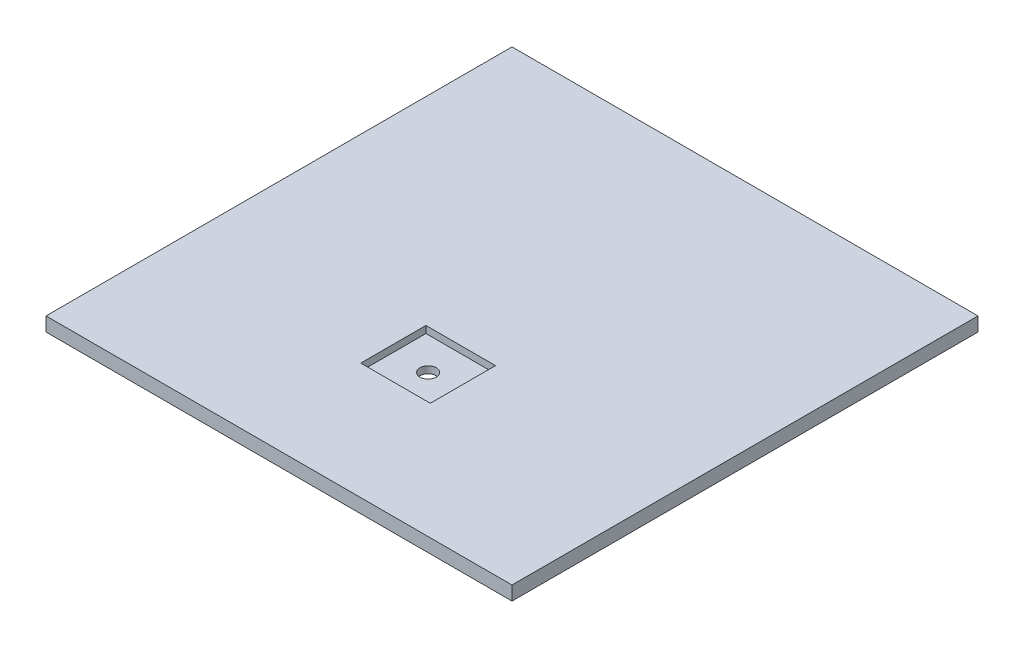
ISO-10303-21;
HEADER;
FILE_DESCRIPTION(('STEP AP214'),'2;1');
FILE_NAME('part.step','',(''),(''),'','','');
FILE_SCHEMA(('AUTOMOTIVE_DESIGN { 1 0 10303 214 1 1 1 1 }'));
ENDSEC;
DATA;
#1=APPLICATION_CONTEXT('core data for automotive mechanical design processes');
#2=APPLICATION_PROTOCOL_DEFINITION('international standard','automotive_design',2000,#1);
#3=PRODUCT_CONTEXT('',#1,'mechanical');
#4=PRODUCT('Part','Part','',(#3));
#5=PRODUCT_RELATED_PRODUCT_CATEGORY('part','',(#4));
#6=PRODUCT_DEFINITION_FORMATION('','',#4);
#7=PRODUCT_DEFINITION_CONTEXT('part definition',#1,'design');
#8=PRODUCT_DEFINITION('design','',#6,#7);
#9=PRODUCT_DEFINITION_SHAPE('','',#8);
#10=(LENGTH_UNIT() NAMED_UNIT(*) SI_UNIT(.MILLI.,.METRE.));
#11=(NAMED_UNIT(*) PLANE_ANGLE_UNIT() SI_UNIT($,.RADIAN.));
#12=(NAMED_UNIT(*) SI_UNIT($,.STERADIAN.) SOLID_ANGLE_UNIT());
#13=UNCERTAINTY_MEASURE_WITH_UNIT(LENGTH_MEASURE(1.E-05),#10,'distance_accuracy_value','');
#14=(GEOMETRIC_REPRESENTATION_CONTEXT(3) GLOBAL_UNCERTAINTY_ASSIGNED_CONTEXT((#13)) GLOBAL_UNIT_ASSIGNED_CONTEXT((#10,
#11,#12)) REPRESENTATION_CONTEXT('',''));
#15=CARTESIAN_POINT('',(0.,0.,0.));
#16=DIRECTION('',(0.,0.,1.));
#17=DIRECTION('',(1.,0.,0.));
#18=AXIS2_PLACEMENT_3D('',#15,#16,#17);
#19=CARTESIAN_POINT('',(12.953774531148,3.,9.61478711162257));
#20=DIRECTION('',(0.,-1.,0.));
#21=DIRECTION('',(0.,0.,-1.));
#22=AXIS2_PLACEMENT_3D('',#19,#20,#21);
#23=CYLINDRICAL_SURFACE('',#22,1.75);
#24=CARTESIAN_POINT('',(12.953774531148,0.,9.61478711162257));
#25=DIRECTION('',(0.,1.,0.));
#26=DIRECTION('',(0.,0.,1.));
#27=AXIS2_PLACEMENT_3D('',#24,#25,#26);
#28=CIRCLE('',#27,1.75);
#29=CARTESIAN_POINT('',(12.953774531148,0.,11.3647871116226));
#30=VERTEX_POINT('',#29);
#31=EDGE_CURVE('E146',#30,#30,#28,.T.);
#32=ORIENTED_EDGE('',*,*,#31,.F.);
#33=EDGE_LOOP('',(#32));
#34=FACE_BOUND('',#33,.T.);
#35=CARTESIAN_POINT('',(12.953774531148,1.5,9.61478711162257));
#36=DIRECTION('',(0.,1.,0.));
#37=DIRECTION('',(0.,0.,1.));
#38=AXIS2_PLACEMENT_3D('',#35,#36,#37);
#39=CIRCLE('',#38,1.75);
#40=CARTESIAN_POINT('',(12.953774531148,1.5,11.3647871116226));
#41=VERTEX_POINT('',#40);
#42=EDGE_CURVE('E37',#41,#41,#39,.T.);
#43=ORIENTED_EDGE('',*,*,#42,.T.);
#44=EDGE_LOOP('',(#43));
#45=FACE_BOUND('',#44,.T.);
#46=ADVANCED_FACE('F33',(#34,#45),#23,.F.);
#47=CARTESIAN_POINT('',(0.,3.,0.));
#48=DIRECTION('',(0.,1.,0.));
#49=DIRECTION('',(0.,0.,1.));
#50=AXIS2_PLACEMENT_3D('',#47,#48,#49);
#51=PLANE('',#50);
#52=DIRECTION('',(0.,0.,1.));
#53=VECTOR('',#52,1.);
#54=CARTESIAN_POINT('',(5.4915322734334,3.,2.61893499501515));
#55=LINE('',#54,#53);
#56=CARTESIAN_POINT('',(5.4915322734334,3.,2.61893499501515));
#57=VERTEX_POINT('',#56);
#58=CARTESIAN_POINT('',(5.4915322734334,3.,16.61063922823));
#59=VERTEX_POINT('',#58);
#60=EDGE_CURVE('E49',#57,#59,#55,.T.);
#61=ORIENTED_EDGE('',*,*,#60,.F.);
#62=DIRECTION('',(-1.,0.,0.));
#63=VECTOR('',#62,1.);
#64=CARTESIAN_POINT('',(5.4915322734334,3.,2.61893499501515));
#65=LINE('',#64,#63);
#66=CARTESIAN_POINT('',(20.4160167888626,3.,2.61893499501515));
#67=VERTEX_POINT('',#66);
#68=EDGE_CURVE('E128',#67,#57,#65,.T.);
#69=ORIENTED_EDGE('',*,*,#68,.F.);
#70=DIRECTION('',(0.,0.,-1.));
#71=VECTOR('',#70,1.);
#72=CARTESIAN_POINT('',(20.4160167888626,3.,2.61893499501515));
#73=LINE('',#72,#71);
#74=CARTESIAN_POINT('',(20.4160167888626,3.,16.61063922823));
#75=VERTEX_POINT('',#74);
#76=EDGE_CURVE('E131',#75,#67,#73,.T.);
#77=ORIENTED_EDGE('',*,*,#76,.F.);
#78=DIRECTION('',(1.,0.,0.));
#79=VECTOR('',#78,1.);
#80=CARTESIAN_POINT('',(5.4915322734334,3.,16.61063922823));
#81=LINE('',#80,#79);
#82=EDGE_CURVE('E137',#59,#75,#81,.T.);
#83=ORIENTED_EDGE('',*,*,#82,.F.);
#84=EDGE_LOOP('',(#61,#69,#77,#83));
#85=FACE_BOUND('',#84,.T.);
#86=DIRECTION('',(0.,0.,1.));
#87=VECTOR('',#86,1.);
#88=CARTESIAN_POINT('',(-37.046225468852,3.,-58.3852128883774));
#89=LINE('',#88,#87);
#90=CARTESIAN_POINT('',(-37.046225468852,3.,-58.3852128883774));
#91=VERTEX_POINT('',#90);
#92=CARTESIAN_POINT('',(-37.046225468852,3.,41.6147871116226));
#93=VERTEX_POINT('',#92);
#94=EDGE_CURVE('E150',#91,#93,#89,.T.);
#95=ORIENTED_EDGE('',*,*,#94,.T.);
#96=DIRECTION('',(1.,0.,0.));
#97=VECTOR('',#96,1.);
#98=CARTESIAN_POINT('',(-37.046225468852,3.,41.6147871116226));
#99=LINE('',#98,#97);
#100=CARTESIAN_POINT('',(62.953774531148,3.,41.6147871116226));
#101=VERTEX_POINT('',#100);
#102=EDGE_CURVE('E86',#93,#101,#99,.T.);
#103=ORIENTED_EDGE('',*,*,#102,.T.);
#104=DIRECTION('',(0.,0.,-1.));
#105=VECTOR('',#104,1.);
#106=CARTESIAN_POINT('',(62.953774531148,3.,-58.3852128883774));
#107=LINE('',#106,#105);
#108=CARTESIAN_POINT('',(62.953774531148,3.,-58.3852128883774));
#109=VERTEX_POINT('',#108);
#110=EDGE_CURVE('E153',#101,#109,#107,.T.);
#111=ORIENTED_EDGE('',*,*,#110,.T.);
#112=DIRECTION('',(-1.,0.,0.));
#113=VECTOR('',#112,1.);
#114=CARTESIAN_POINT('',(-37.046225468852,3.,-58.3852128883774));
#115=LINE('',#114,#113);
#116=EDGE_CURVE('E58',#109,#91,#115,.T.);
#117=ORIENTED_EDGE('',*,*,#116,.T.);
#118=EDGE_LOOP('',(#95,#103,#111,#117));
#119=FACE_BOUND('',#118,.T.);
#120=ADVANCED_FACE('F193',(#85,#119),#51,.T.);
#121=CARTESIAN_POINT('',(0.,0.,0.));
#122=DIRECTION('',(0.,1.,0.));
#123=DIRECTION('',(0.,0.,1.));
#124=AXIS2_PLACEMENT_3D('',#121,#122,#123);
#125=PLANE('',#124);
#126=DIRECTION('',(0.,0.,1.));
#127=VECTOR('',#126,1.);
#128=CARTESIAN_POINT('',(-37.046225468852,0.,-58.3852128883774));
#129=LINE('',#128,#127);
#130=CARTESIAN_POINT('',(-37.046225468852,0.,-58.3852128883774));
#131=VERTEX_POINT('',#130);
#132=CARTESIAN_POINT('',(-37.046225468852,0.,41.6147871116226));
#133=VERTEX_POINT('',#132);
#134=EDGE_CURVE('E149',#131,#133,#129,.T.);
#135=ORIENTED_EDGE('',*,*,#134,.F.);
#136=DIRECTION('',(-1.,0.,0.));
#137=VECTOR('',#136,1.);
#138=CARTESIAN_POINT('',(-37.046225468852,0.,-58.3852128883774));
#139=LINE('',#138,#137);
#140=CARTESIAN_POINT('',(62.953774531148,0.,-58.3852128883774));
#141=VERTEX_POINT('',#140);
#142=EDGE_CURVE('E79',#141,#131,#139,.T.);
#143=ORIENTED_EDGE('',*,*,#142,.F.);
#144=DIRECTION('',(0.,0.,-1.));
#145=VECTOR('',#144,1.);
#146=CARTESIAN_POINT('',(62.953774531148,0.,-58.3852128883774));
#147=LINE('',#146,#145);
#148=CARTESIAN_POINT('',(62.953774531148,0.,41.6147871116226));
#149=VERTEX_POINT('',#148);
#150=EDGE_CURVE('E161',#149,#141,#147,.T.);
#151=ORIENTED_EDGE('',*,*,#150,.F.);
#152=DIRECTION('',(1.,0.,0.));
#153=VECTOR('',#152,1.);
#154=CARTESIAN_POINT('',(-37.046225468852,0.,41.6147871116226));
#155=LINE('',#154,#153);
#156=EDGE_CURVE('E159',#133,#149,#155,.T.);
#157=ORIENTED_EDGE('',*,*,#156,.F.);
#158=EDGE_LOOP('',(#135,#143,#151,#157));
#159=FACE_BOUND('',#158,.T.);
#160=ORIENTED_EDGE('',*,*,#31,.T.);
#161=EDGE_LOOP('',(#160));
#162=FACE_BOUND('',#161,.T.);
#163=ADVANCED_FACE('F175',(#159,#162),#125,.F.);
#164=CARTESIAN_POINT('',(-37.046225468852,3.,-58.3852128883774));
#165=DIRECTION('',(1.,0.,0.));
#166=DIRECTION('',(0.,0.,-1.));
#167=AXIS2_PLACEMENT_3D('',#164,#165,#166);
#168=PLANE('',#167);
#169=ORIENTED_EDGE('',*,*,#134,.T.);
#170=DIRECTION('',(0.,-1.,0.));
#171=VECTOR('',#170,1.);
#172=CARTESIAN_POINT('',(-37.046225468852,3.,41.6147871116226));
#173=LINE('',#172,#171);
#174=EDGE_CURVE('E11',#93,#133,#173,.T.);
#175=ORIENTED_EDGE('',*,*,#174,.F.);
#176=ORIENTED_EDGE('',*,*,#94,.F.);
#177=DIRECTION('',(0.,-1.,0.));
#178=VECTOR('',#177,1.);
#179=CARTESIAN_POINT('',(-37.046225468852,3.,-58.3852128883774));
#180=LINE('',#179,#178);
#181=EDGE_CURVE('E156',#91,#131,#180,.T.);
#182=ORIENTED_EDGE('',*,*,#181,.T.);
#183=EDGE_LOOP('',(#169,#175,#176,#182));
#184=FACE_BOUND('',#183,.T.);
#185=ADVANCED_FACE('F35',(#184),#168,.F.);
#186=CARTESIAN_POINT('',(-37.046225468852,3.,41.6147871116226));
#187=DIRECTION('',(0.,0.,-1.));
#188=DIRECTION('',(-1.,0.,0.));
#189=AXIS2_PLACEMENT_3D('',#186,#187,#188);
#190=PLANE('',#189);
#191=ORIENTED_EDGE('',*,*,#156,.T.);
#192=DIRECTION('',(0.,-1.,0.));
#193=VECTOR('',#192,1.);
#194=CARTESIAN_POINT('',(62.953774531148,3.,41.6147871116226));
#195=LINE('',#194,#193);
#196=EDGE_CURVE('E42',#101,#149,#195,.T.);
#197=ORIENTED_EDGE('',*,*,#196,.F.);
#198=ORIENTED_EDGE('',*,*,#102,.F.);
#199=ORIENTED_EDGE('',*,*,#174,.T.);
#200=EDGE_LOOP('',(#191,#197,#198,#199));
#201=FACE_BOUND('',#200,.T.);
#202=ADVANCED_FACE('F189',(#201),#190,.F.);
#203=CARTESIAN_POINT('',(62.953774531148,3.,-58.3852128883774));
#204=DIRECTION('',(-1.,0.,0.));
#205=DIRECTION('',(0.,0.,1.));
#206=AXIS2_PLACEMENT_3D('',#203,#204,#205);
#207=PLANE('',#206);
#208=ORIENTED_EDGE('',*,*,#150,.T.);
#209=DIRECTION('',(0.,-1.,0.));
#210=VECTOR('',#209,1.);
#211=CARTESIAN_POINT('',(62.953774531148,3.,-58.3852128883774));
#212=LINE('',#211,#210);
#213=EDGE_CURVE('E165',#109,#141,#212,.T.);
#214=ORIENTED_EDGE('',*,*,#213,.F.);
#215=ORIENTED_EDGE('',*,*,#110,.F.);
#216=ORIENTED_EDGE('',*,*,#196,.T.);
#217=EDGE_LOOP('',(#208,#214,#215,#216));
#218=FACE_BOUND('',#217,.T.);
#219=ADVANCED_FACE('F171',(#218),#207,.F.);
#220=CARTESIAN_POINT('',(-37.046225468852,3.,-58.3852128883774));
#221=DIRECTION('',(0.,0.,1.));
#222=DIRECTION('',(1.,0.,0.));
#223=AXIS2_PLACEMENT_3D('',#220,#221,#222);
#224=PLANE('',#223);
#225=ORIENTED_EDGE('',*,*,#142,.T.);
#226=ORIENTED_EDGE('',*,*,#181,.F.);
#227=ORIENTED_EDGE('',*,*,#116,.F.);
#228=ORIENTED_EDGE('',*,*,#213,.T.);
#229=EDGE_LOOP('',(#225,#226,#227,#228));
#230=FACE_BOUND('',#229,.T.);
#231=ADVANCED_FACE('F180',(#230),#224,.F.);
#232=CARTESIAN_POINT('',(5.4915322734334,1.5,2.61893499501515));
#233=DIRECTION('',(-1.,0.,0.));
#234=DIRECTION('',(0.,0.,1.));
#235=AXIS2_PLACEMENT_3D('',#232,#233,#234);
#236=PLANE('',#235);
#237=ORIENTED_EDGE('',*,*,#60,.T.);
#238=DIRECTION('',(0.,1.,0.));
#239=VECTOR('',#238,1.);
#240=CARTESIAN_POINT('',(5.4915322734334,1.5,16.61063922823));
#241=LINE('',#240,#239);
#242=CARTESIAN_POINT('',(5.4915322734334,1.5,16.61063922823));
#243=VERTEX_POINT('',#242);
#244=EDGE_CURVE('E106',#243,#59,#241,.T.);
#245=ORIENTED_EDGE('',*,*,#244,.F.);
#246=DIRECTION('',(0.,0.,1.));
#247=VECTOR('',#246,1.);
#248=CARTESIAN_POINT('',(5.4915322734334,1.5,2.61893499501515));
#249=LINE('',#248,#247);
#250=CARTESIAN_POINT('',(5.4915322734334,1.5,2.61893499501515));
#251=VERTEX_POINT('',#250);
#252=EDGE_CURVE('E110',#251,#243,#249,.T.);
#253=ORIENTED_EDGE('',*,*,#252,.F.);
#254=DIRECTION('',(0.,1.,0.));
#255=VECTOR('',#254,1.);
#256=CARTESIAN_POINT('',(5.4915322734334,1.5,2.61893499501515));
#257=LINE('',#256,#255);
#258=EDGE_CURVE('E141',#251,#57,#257,.T.);
#259=ORIENTED_EDGE('',*,*,#258,.T.);
#260=EDGE_LOOP('',(#237,#245,#253,#259));
#261=FACE_BOUND('',#260,.T.);
#262=ADVANCED_FACE('F108',(#261),#236,.F.);
#263=CARTESIAN_POINT('',(5.4915322734334,1.5,2.61893499501515));
#264=DIRECTION('',(0.,0.,-1.));
#265=DIRECTION('',(-1.,0.,0.));
#266=AXIS2_PLACEMENT_3D('',#263,#264,#265);
#267=PLANE('',#266);
#268=ORIENTED_EDGE('',*,*,#68,.T.);
#269=ORIENTED_EDGE('',*,*,#258,.F.);
#270=DIRECTION('',(-1.,0.,0.));
#271=VECTOR('',#270,1.);
#272=CARTESIAN_POINT('',(5.4915322734334,1.5,2.61893499501515));
#273=LINE('',#272,#271);
#274=CARTESIAN_POINT('',(20.4160167888626,1.5,2.61893499501515));
#275=VERTEX_POINT('',#274);
#276=EDGE_CURVE('E116',#275,#251,#273,.T.);
#277=ORIENTED_EDGE('',*,*,#276,.F.);
#278=DIRECTION('',(0.,1.,0.));
#279=VECTOR('',#278,1.);
#280=CARTESIAN_POINT('',(20.4160167888626,1.5,2.61893499501515));
#281=LINE('',#280,#279);
#282=EDGE_CURVE('E143',#275,#67,#281,.T.);
#283=ORIENTED_EDGE('',*,*,#282,.T.);
#284=EDGE_LOOP('',(#268,#269,#277,#283));
#285=FACE_BOUND('',#284,.T.);
#286=ADVANCED_FACE('F187',(#285),#267,.F.);
#287=CARTESIAN_POINT('',(20.4160167888626,1.5,2.61893499501515));
#288=DIRECTION('',(1.,0.,0.));
#289=DIRECTION('',(0.,0.,-1.));
#290=AXIS2_PLACEMENT_3D('',#287,#288,#289);
#291=PLANE('',#290);
#292=ORIENTED_EDGE('',*,*,#76,.T.);
#293=ORIENTED_EDGE('',*,*,#282,.F.);
#294=DIRECTION('',(0.,0.,-1.));
#295=VECTOR('',#294,1.);
#296=CARTESIAN_POINT('',(20.4160167888626,1.5,2.61893499501515));
#297=LINE('',#296,#295);
#298=CARTESIAN_POINT('',(20.4160167888626,1.5,16.61063922823));
#299=VERTEX_POINT('',#298);
#300=EDGE_CURVE('E124',#299,#275,#297,.T.);
#301=ORIENTED_EDGE('',*,*,#300,.F.);
#302=DIRECTION('',(0.,1.,0.));
#303=VECTOR('',#302,1.);
#304=CARTESIAN_POINT('',(20.4160167888626,1.5,16.61063922823));
#305=LINE('',#304,#303);
#306=EDGE_CURVE('E115',#299,#75,#305,.T.);
#307=ORIENTED_EDGE('',*,*,#306,.T.);
#308=EDGE_LOOP('',(#292,#293,#301,#307));
#309=FACE_BOUND('',#308,.T.);
#310=ADVANCED_FACE('F247',(#309),#291,.F.);
#311=CARTESIAN_POINT('',(5.4915322734334,1.5,16.61063922823));
#312=DIRECTION('',(0.,0.,1.));
#313=DIRECTION('',(1.,0.,0.));
#314=AXIS2_PLACEMENT_3D('',#311,#312,#313);
#315=PLANE('',#314);
#316=ORIENTED_EDGE('',*,*,#82,.T.);
#317=ORIENTED_EDGE('',*,*,#306,.F.);
#318=DIRECTION('',(1.,0.,0.));
#319=VECTOR('',#318,1.);
#320=CARTESIAN_POINT('',(5.4915322734334,1.5,16.61063922823));
#321=LINE('',#320,#319);
#322=EDGE_CURVE('E119',#243,#299,#321,.T.);
#323=ORIENTED_EDGE('',*,*,#322,.F.);
#324=ORIENTED_EDGE('',*,*,#244,.T.);
#325=EDGE_LOOP('',(#316,#317,#323,#324));
#326=FACE_BOUND('',#325,.T.);
#327=ADVANCED_FACE('F120',(#326),#315,.F.);
#328=CARTESIAN_POINT('',(0.,1.5,0.));
#329=DIRECTION('',(0.,1.,0.));
#330=DIRECTION('',(0.,0.,1.));
#331=AXIS2_PLACEMENT_3D('',#328,#329,#330);
#332=PLANE('',#331);
#333=ORIENTED_EDGE('',*,*,#42,.F.);
#334=EDGE_LOOP('',(#333));
#335=FACE_BOUND('',#334,.T.);
#336=ORIENTED_EDGE('',*,*,#252,.T.);
#337=ORIENTED_EDGE('',*,*,#322,.T.);
#338=ORIENTED_EDGE('',*,*,#300,.T.);
#339=ORIENTED_EDGE('',*,*,#276,.T.);
#340=EDGE_LOOP('',(#336,#337,#338,#339));
#341=FACE_BOUND('',#340,.T.);
#342=ADVANCED_FACE('F126',(#335,#341),#332,.T.);
#343=CLOSED_SHELL('',(#46,#120,#163,#185,#202,#219,#231,#262,#286,#310,#327,#342));
#344=MANIFOLD_SOLID_BREP('B2',#343);
#345=ADVANCED_BREP_SHAPE_REPRESENTATION('',(#18,#344),#14);
#346=SHAPE_DEFINITION_REPRESENTATION(#9,#345);
ENDSEC;
END-ISO-10303-21;
